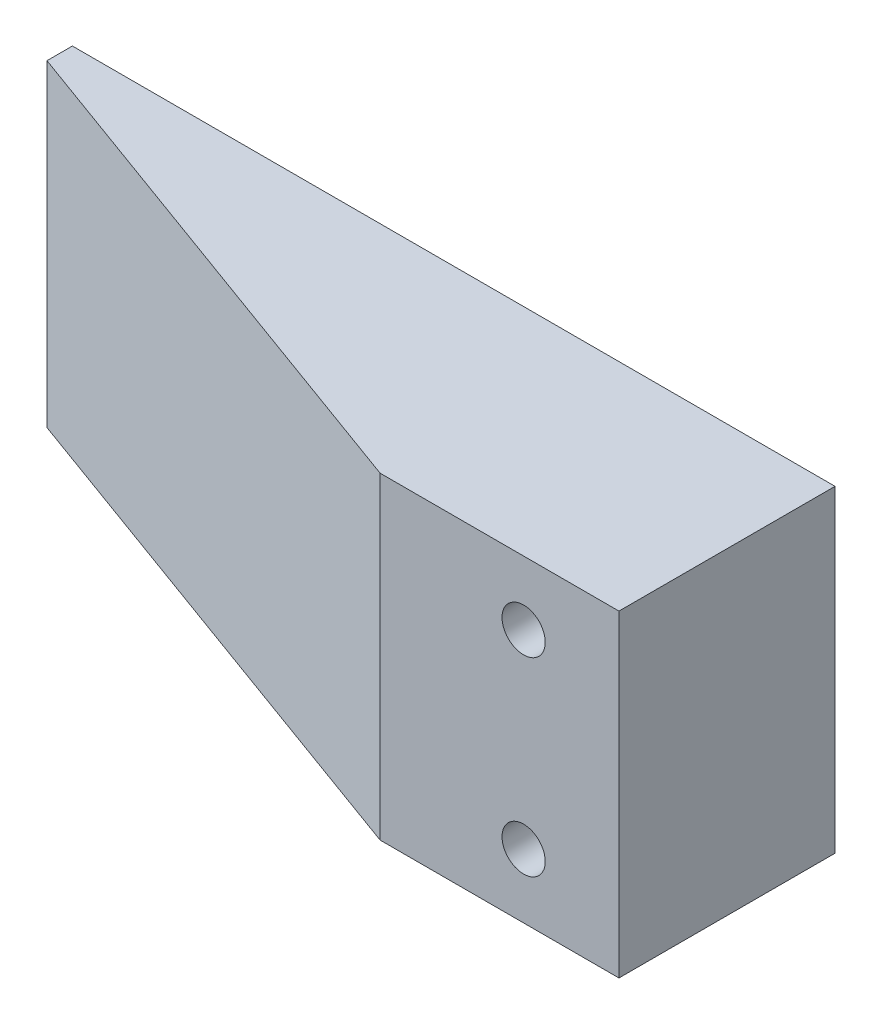
ISO-10303-21;
HEADER;
FILE_DESCRIPTION(('STEP AP214'),'2;1');
FILE_NAME('part.step','',(''),(''),'','','');
FILE_SCHEMA(('AUTOMOTIVE_DESIGN { 1 0 10303 214 1 1 1 1 }'));
ENDSEC;
DATA;
#1=APPLICATION_CONTEXT('core data for automotive mechanical design processes');
#2=APPLICATION_PROTOCOL_DEFINITION('international standard','automotive_design',2000,#1);
#3=PRODUCT_CONTEXT('',#1,'mechanical');
#4=PRODUCT('Part','Part','',(#3));
#5=PRODUCT_RELATED_PRODUCT_CATEGORY('part','',(#4));
#6=PRODUCT_DEFINITION_FORMATION('','',#4);
#7=PRODUCT_DEFINITION_CONTEXT('part definition',#1,'design');
#8=PRODUCT_DEFINITION('design','',#6,#7);
#9=PRODUCT_DEFINITION_SHAPE('','',#8);
#10=(LENGTH_UNIT() NAMED_UNIT(*) SI_UNIT(.MILLI.,.METRE.));
#11=(NAMED_UNIT(*) PLANE_ANGLE_UNIT() SI_UNIT($,.RADIAN.));
#12=(NAMED_UNIT(*) SI_UNIT($,.STERADIAN.) SOLID_ANGLE_UNIT());
#13=UNCERTAINTY_MEASURE_WITH_UNIT(LENGTH_MEASURE(1.E-05),#10,'distance_accuracy_value','');
#14=(GEOMETRIC_REPRESENTATION_CONTEXT(3) GLOBAL_UNCERTAINTY_ASSIGNED_CONTEXT((#13)) GLOBAL_UNIT_ASSIGNED_CONTEXT((#10,
#11,#12)) REPRESENTATION_CONTEXT('',''));
#15=CARTESIAN_POINT('',(0.,0.,0.));
#16=DIRECTION('',(0.,0.,1.));
#17=DIRECTION('',(1.,0.,0.));
#18=AXIS2_PLACEMENT_3D('',#15,#16,#17);
#19=CARTESIAN_POINT('',(7.50000000000001,12.5,-8.5));
#20=DIRECTION('',(1.,0.,0.));
#21=DIRECTION('',(0.,1.,0.));
#22=AXIS2_PLACEMENT_3D('',#19,#20,#21);
#23=PLANE('',#22);
#24=DIRECTION('',(0.,0.,1.));
#25=VECTOR('',#24,1.);
#26=CARTESIAN_POINT('',(7.50000000000001,12.5,-8.5));
#27=LINE('',#26,#25);
#28=CARTESIAN_POINT('',(7.50000000000001,12.5,-8.5));
#29=VERTEX_POINT('',#28);
#30=CARTESIAN_POINT('',(7.50000000000001,12.5,8.5));
#31=VERTEX_POINT('',#30);
#32=EDGE_CURVE('E88',#29,#31,#27,.T.);
#33=ORIENTED_EDGE('',*,*,#32,.T.);
#34=DIRECTION('',(0.,1.,0.));
#35=VECTOR('',#34,1.);
#36=CARTESIAN_POINT('',(7.50000000000001,12.5,8.5));
#37=LINE('',#36,#35);
#38=CARTESIAN_POINT('',(7.5,-12.5,8.5));
#39=VERTEX_POINT('',#38);
#40=EDGE_CURVE('E92',#39,#31,#37,.T.);
#41=ORIENTED_EDGE('',*,*,#40,.F.);
#42=DIRECTION('',(0.,0.,1.));
#43=VECTOR('',#42,1.);
#44=CARTESIAN_POINT('',(7.5,-12.5,-8.5));
#45=LINE('',#44,#43);
#46=CARTESIAN_POINT('',(7.5,-12.5,-8.5));
#47=VERTEX_POINT('',#46);
#48=EDGE_CURVE('E133',#47,#39,#45,.T.);
#49=ORIENTED_EDGE('',*,*,#48,.F.);
#50=DIRECTION('',(0.,1.,0.));
#51=VECTOR('',#50,1.);
#52=CARTESIAN_POINT('',(7.50000000000001,12.5,-8.5));
#53=LINE('',#52,#51);
#54=EDGE_CURVE('E94',#47,#29,#53,.T.);
#55=ORIENTED_EDGE('',*,*,#54,.T.);
#56=EDGE_LOOP('',(#33,#41,#49,#55));
#57=FACE_BOUND('',#56,.T.);
#58=ADVANCED_FACE('F41',(#57),#23,.T.);
#59=CARTESIAN_POINT('',(-7.49999999999999,-12.5,-8.5));
#60=DIRECTION('',(0.,-1.,0.));
#61=DIRECTION('',(1.,0.,0.));
#62=AXIS2_PLACEMENT_3D('',#59,#60,#61);
#63=PLANE('',#62);
#64=DIRECTION('',(1.,0.,0.));
#65=VECTOR('',#64,1.);
#66=CARTESIAN_POINT('',(-7.49999999999999,-12.5,8.5));
#67=LINE('',#66,#65);
#68=CARTESIAN_POINT('',(-11.2878387081807,-12.5,8.5));
#69=VERTEX_POINT('',#68);
#70=EDGE_CURVE('E107',#69,#39,#67,.T.);
#71=ORIENTED_EDGE('',*,*,#70,.F.);
#72=DIRECTION('',(0.939692620785908,0.,0.34202014332567));
#73=VECTOR('',#72,1.);
#74=CARTESIAN_POINT('',(-13.4067876395095,-12.5,7.72876566106613));
#75=LINE('',#74,#73);
#76=CARTESIAN_POINT('',(-52.5,-12.5,-6.50000000000002));
#77=VERTEX_POINT('',#76);
#78=EDGE_CURVE('E64',#69,#77,#75,.F.);
#79=ORIENTED_EDGE('',*,*,#78,.T.);
#80=DIRECTION('',(0.,0.,1.));
#81=VECTOR('',#80,1.);
#82=CARTESIAN_POINT('',(-52.5,-12.5,-8.5));
#83=LINE('',#82,#81);
#84=CARTESIAN_POINT('',(-52.5,-12.5,-8.5));
#85=VERTEX_POINT('',#84);
#86=EDGE_CURVE('E136',#85,#77,#83,.T.);
#87=ORIENTED_EDGE('',*,*,#86,.F.);
#88=DIRECTION('',(1.,0.,0.));
#89=VECTOR('',#88,1.);
#90=CARTESIAN_POINT('',(-7.49999999999999,-12.5,-8.5));
#91=LINE('',#90,#89);
#92=EDGE_CURVE('E98',#85,#47,#91,.T.);
#93=ORIENTED_EDGE('',*,*,#92,.T.);
#94=ORIENTED_EDGE('',*,*,#48,.T.);
#95=EDGE_LOOP('',(#71,#79,#87,#93,#94));
#96=FACE_BOUND('',#95,.T.);
#97=ADVANCED_FACE('F141',(#96),#63,.T.);
#98=CARTESIAN_POINT('',(-52.5,12.5,-8.5));
#99=DIRECTION('',(-1.,0.,0.));
#100=DIRECTION('',(0.,0.,1.));
#101=AXIS2_PLACEMENT_3D('',#98,#99,#100);
#102=PLANE('',#101);
#103=ORIENTED_EDGE('',*,*,#86,.T.);
#104=DIRECTION('',(0.,1.,0.));
#105=VECTOR('',#104,1.);
#106=CARTESIAN_POINT('',(-52.5,12.5,-6.50000000000002));
#107=LINE('',#106,#105);
#108=CARTESIAN_POINT('',(-52.5,12.5,-6.50000000000002));
#109=VERTEX_POINT('',#108);
#110=EDGE_CURVE('E50',#77,#109,#107,.T.);
#111=ORIENTED_EDGE('',*,*,#110,.T.);
#112=DIRECTION('',(0.,0.,1.));
#113=VECTOR('',#112,1.);
#114=CARTESIAN_POINT('',(-52.5,12.5,-8.5));
#115=LINE('',#114,#113);
#116=CARTESIAN_POINT('',(-52.5,12.5,-8.5));
#117=VERTEX_POINT('',#116);
#118=EDGE_CURVE('E97',#117,#109,#115,.T.);
#119=ORIENTED_EDGE('',*,*,#118,.F.);
#120=DIRECTION('',(0.,-1.,0.));
#121=VECTOR('',#120,1.);
#122=CARTESIAN_POINT('',(-52.5,12.5,-8.5));
#123=LINE('',#122,#121);
#124=EDGE_CURVE('E129',#117,#85,#123,.T.);
#125=ORIENTED_EDGE('',*,*,#124,.T.);
#126=EDGE_LOOP('',(#103,#111,#119,#125));
#127=FACE_BOUND('',#126,.T.);
#128=ADVANCED_FACE('F146',(#127),#102,.T.);
#129=CARTESIAN_POINT('',(-7.49999999999999,12.5,-8.5));
#130=DIRECTION('',(0.,1.,0.));
#131=DIRECTION('',(-1.,0.,0.));
#132=AXIS2_PLACEMENT_3D('',#129,#130,#131);
#133=PLANE('',#132);
#134=ORIENTED_EDGE('',*,*,#118,.T.);
#135=DIRECTION('',(-0.939692620785908,0.,-0.34202014332567));
#136=VECTOR('',#135,1.);
#137=CARTESIAN_POINT('',(-13.4067876395095,12.5,7.72876566106613));
#138=LINE('',#137,#136);
#139=CARTESIAN_POINT('',(-11.2878387081807,12.5,8.5));
#140=VERTEX_POINT('',#139);
#141=EDGE_CURVE('E11',#109,#140,#138,.F.);
#142=ORIENTED_EDGE('',*,*,#141,.T.);
#143=DIRECTION('',(-1.,0.,0.));
#144=VECTOR('',#143,1.);
#145=CARTESIAN_POINT('',(-7.49999999999999,12.5,8.5));
#146=LINE('',#145,#144);
#147=EDGE_CURVE('E101',#31,#140,#146,.T.);
#148=ORIENTED_EDGE('',*,*,#147,.F.);
#149=ORIENTED_EDGE('',*,*,#32,.F.);
#150=DIRECTION('',(-1.,0.,0.));
#151=VECTOR('',#150,1.);
#152=CARTESIAN_POINT('',(-7.49999999999999,12.5,-8.5));
#153=LINE('',#152,#151);
#154=EDGE_CURVE('E127',#29,#117,#153,.T.);
#155=ORIENTED_EDGE('',*,*,#154,.T.);
#156=EDGE_LOOP('',(#134,#142,#148,#149,#155));
#157=FACE_BOUND('',#156,.T.);
#158=ADVANCED_FACE('F102',(#157),#133,.T.);
#159=CARTESIAN_POINT('',(0.,0.,-8.5));
#160=DIRECTION('',(0.,0.,1.));
#161=DIRECTION('',(1.,0.,0.));
#162=AXIS2_PLACEMENT_3D('',#159,#160,#161);
#163=PLANE('',#162);
#164=CARTESIAN_POINT('',(0.,-7.46666666666667,-8.5));
#165=DIRECTION('',(0.,0.,1.));
#166=DIRECTION('',(1.,0.,0.));
#167=AXIS2_PLACEMENT_3D('',#164,#165,#166);
#168=CIRCLE('',#167,1.7);
#169=CARTESIAN_POINT('',(1.7,-7.46666666666667,-8.5));
#170=VERTEX_POINT('',#169);
#171=EDGE_CURVE('E120',#170,#170,#168,.T.);
#172=ORIENTED_EDGE('',*,*,#171,.T.);
#173=EDGE_LOOP('',(#172));
#174=FACE_BOUND('',#173,.T.);
#175=CARTESIAN_POINT('',(0.,7.46666666666666,-8.5));
#176=DIRECTION('',(0.,0.,1.));
#177=DIRECTION('',(1.,0.,0.));
#178=AXIS2_PLACEMENT_3D('',#175,#176,#177);
#179=CIRCLE('',#178,1.7);
#180=CARTESIAN_POINT('',(1.7,7.46666666666666,-8.5));
#181=VERTEX_POINT('',#180);
#182=EDGE_CURVE('E123',#181,#181,#179,.T.);
#183=ORIENTED_EDGE('',*,*,#182,.T.);
#184=EDGE_LOOP('',(#183));
#185=FACE_BOUND('',#184,.T.);
#186=ORIENTED_EDGE('',*,*,#54,.F.);
#187=ORIENTED_EDGE('',*,*,#92,.F.);
#188=ORIENTED_EDGE('',*,*,#124,.F.);
#189=ORIENTED_EDGE('',*,*,#154,.F.);
#190=EDGE_LOOP('',(#186,#187,#188,#189));
#191=FACE_BOUND('',#190,.T.);
#192=ADVANCED_FACE('F144',(#174,#185,#191),#163,.F.);
#193=CARTESIAN_POINT('',(0.,7.46666666666666,-8.5));
#194=DIRECTION('',(0.,0.,1.));
#195=DIRECTION('',(1.,0.,0.));
#196=AXIS2_PLACEMENT_3D('',#193,#194,#195);
#197=CYLINDRICAL_SURFACE('',#196,1.7);
#198=ORIENTED_EDGE('',*,*,#182,.F.);
#199=EDGE_LOOP('',(#198));
#200=FACE_BOUND('',#199,.T.);
#201=CARTESIAN_POINT('',(0.,7.46666666666666,8.5));
#202=DIRECTION('',(0.,0.,1.));
#203=DIRECTION('',(1.,0.,0.));
#204=AXIS2_PLACEMENT_3D('',#201,#202,#203);
#205=CIRCLE('',#204,1.7);
#206=CARTESIAN_POINT('',(1.7,7.46666666666666,8.5));
#207=VERTEX_POINT('',#206);
#208=EDGE_CURVE('E112',#207,#207,#205,.T.);
#209=ORIENTED_EDGE('',*,*,#208,.T.);
#210=EDGE_LOOP('',(#209));
#211=FACE_BOUND('',#210,.T.);
#212=ADVANCED_FACE('F166',(#200,#211),#197,.F.);
#213=CARTESIAN_POINT('',(0.,-7.46666666666667,-8.5));
#214=DIRECTION('',(0.,0.,1.));
#215=DIRECTION('',(1.,0.,0.));
#216=AXIS2_PLACEMENT_3D('',#213,#214,#215);
#217=CYLINDRICAL_SURFACE('',#216,1.7);
#218=ORIENTED_EDGE('',*,*,#171,.F.);
#219=EDGE_LOOP('',(#218));
#220=FACE_BOUND('',#219,.T.);
#221=CARTESIAN_POINT('',(0.,-7.46666666666667,8.5));
#222=DIRECTION('',(0.,0.,1.));
#223=DIRECTION('',(1.,0.,0.));
#224=AXIS2_PLACEMENT_3D('',#221,#222,#223);
#225=CIRCLE('',#224,1.7);
#226=CARTESIAN_POINT('',(1.7,-7.46666666666667,8.5));
#227=VERTEX_POINT('',#226);
#228=EDGE_CURVE('E115',#227,#227,#225,.T.);
#229=ORIENTED_EDGE('',*,*,#228,.T.);
#230=EDGE_LOOP('',(#229));
#231=FACE_BOUND('',#230,.T.);
#232=ADVANCED_FACE('F151',(#220,#231),#217,.F.);
#233=CARTESIAN_POINT('',(0.,0.,8.5));
#234=DIRECTION('',(0.,0.,1.));
#235=DIRECTION('',(1.,0.,0.));
#236=AXIS2_PLACEMENT_3D('',#233,#234,#235);
#237=PLANE('',#236);
#238=ORIENTED_EDGE('',*,*,#208,.F.);
#239=EDGE_LOOP('',(#238));
#240=FACE_BOUND('',#239,.T.);
#241=ORIENTED_EDGE('',*,*,#147,.T.);
#242=DIRECTION('',(0.,-1.,0.));
#243=VECTOR('',#242,1.);
#244=CARTESIAN_POINT('',(-11.2878387081807,0.,8.5));
#245=LINE('',#244,#243);
#246=EDGE_CURVE('E135',#140,#69,#245,.T.);
#247=ORIENTED_EDGE('',*,*,#246,.T.);
#248=ORIENTED_EDGE('',*,*,#70,.T.);
#249=ORIENTED_EDGE('',*,*,#40,.T.);
#250=EDGE_LOOP('',(#241,#247,#248,#249));
#251=FACE_BOUND('',#250,.T.);
#252=ORIENTED_EDGE('',*,*,#228,.F.);
#253=EDGE_LOOP('',(#252));
#254=FACE_BOUND('',#253,.T.);
#255=ADVANCED_FACE('F109',(#240,#251,#254),#237,.T.);
#256=CARTESIAN_POINT('',(-11.2878387081807,0.,8.5));
#257=DIRECTION('',(0.34202014332567,0.,-0.939692620785908));
#258=DIRECTION('',(0.,-1.,0.));
#259=AXIS2_PLACEMENT_3D('',#256,#257,#258);
#260=PLANE('',#259);
#261=ORIENTED_EDGE('',*,*,#141,.F.);
#262=ORIENTED_EDGE('',*,*,#110,.F.);
#263=ORIENTED_EDGE('',*,*,#78,.F.);
#264=ORIENTED_EDGE('',*,*,#246,.F.);
#265=EDGE_LOOP('',(#261,#262,#263,#264));
#266=FACE_BOUND('',#265,.T.);
#267=ADVANCED_FACE('F44',(#266),#260,.F.);
#268=CLOSED_SHELL('',(#58,#97,#128,#158,#192,#212,#232,#255,#267));
#269=MANIFOLD_SOLID_BREP('B2',#268);
#270=ADVANCED_BREP_SHAPE_REPRESENTATION('',(#18,#269),#14);
#271=SHAPE_DEFINITION_REPRESENTATION(#9,#270);
ENDSEC;
END-ISO-10303-21;
